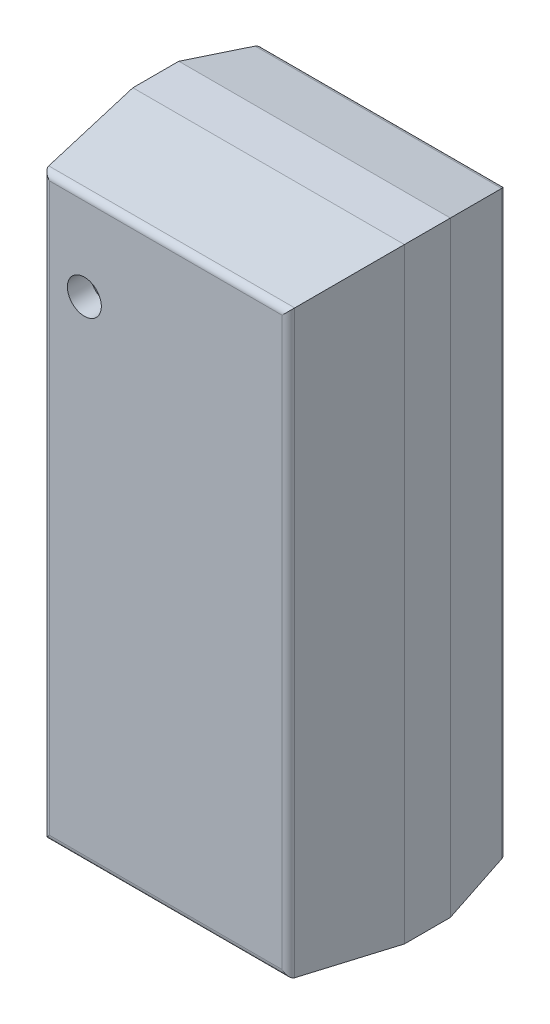
ISO-10303-21;
HEADER;
FILE_DESCRIPTION(('STEP AP214'),'2;1');
FILE_NAME('part.step','',(''),(''),'','','');
FILE_SCHEMA(('AUTOMOTIVE_DESIGN { 1 0 10303 214 1 1 1 1 }'));
ENDSEC;
DATA;
#1=APPLICATION_CONTEXT('core data for automotive mechanical design processes');
#2=APPLICATION_PROTOCOL_DEFINITION('international standard','automotive_design',2000,#1);
#3=PRODUCT_CONTEXT('',#1,'mechanical');
#4=PRODUCT('Part','Part','',(#3));
#5=PRODUCT_RELATED_PRODUCT_CATEGORY('part','',(#4));
#6=PRODUCT_DEFINITION_FORMATION('','',#4);
#7=PRODUCT_DEFINITION_CONTEXT('part definition',#1,'design');
#8=PRODUCT_DEFINITION('design','',#6,#7);
#9=PRODUCT_DEFINITION_SHAPE('','',#8);
#10=(LENGTH_UNIT() NAMED_UNIT(*) SI_UNIT(.MILLI.,.METRE.));
#11=(NAMED_UNIT(*) PLANE_ANGLE_UNIT() SI_UNIT($,.RADIAN.));
#12=(NAMED_UNIT(*) SI_UNIT($,.STERADIAN.) SOLID_ANGLE_UNIT());
#13=UNCERTAINTY_MEASURE_WITH_UNIT(LENGTH_MEASURE(1.E-05),#10,'distance_accuracy_value','');
#14=(GEOMETRIC_REPRESENTATION_CONTEXT(3) GLOBAL_UNCERTAINTY_ASSIGNED_CONTEXT((#13)) GLOBAL_UNIT_ASSIGNED_CONTEXT((#10,
#11,#12)) REPRESENTATION_CONTEXT('',''));
#15=CARTESIAN_POINT('',(0.,0.,0.));
#16=DIRECTION('',(0.,0.,1.));
#17=DIRECTION('',(1.,0.,0.));
#18=AXIS2_PLACEMENT_3D('',#15,#16,#17);
#19=CARTESIAN_POINT('',(-0.39,0.96,0.99));
#20=DIRECTION('',(0.,0.,1.));
#21=DIRECTION('',(1.,0.,0.));
#22=AXIS2_PLACEMENT_3D('',#19,#20,#21);
#23=PLANE('',#22);
#24=CARTESIAN_POINT('',(-0.39,0.96,0.99));
#25=DIRECTION('',(0.,0.,1.));
#26=DIRECTION('',(1.,0.,0.));
#27=AXIS2_PLACEMENT_3D('',#24,#25,#26);
#28=CIRCLE('',#27,0.08125);
#29=CARTESIAN_POINT('',(-0.30875,0.96,0.99));
#30=VERTEX_POINT('',#29);
#31=EDGE_CURVE('E20',#30,#30,#28,.T.);
#32=ORIENTED_EDGE('',*,*,#31,.T.);
#33=EDGE_LOOP('',(#32));
#34=FACE_BOUND('',#33,.T.);
#35=ADVANCED_FACE('F17',(#34),#23,.T.);
#36=CARTESIAN_POINT('',(-0.39,0.96,0.99));
#37=DIRECTION('',(0.,0.,1.));
#38=DIRECTION('',(1.,0.,0.));
#39=AXIS2_PLACEMENT_3D('',#36,#37,#38);
#40=CYLINDRICAL_SURFACE('',#39,0.08125);
#41=CARTESIAN_POINT('',(-0.39,0.96,1.1));
#42=DIRECTION('',(0.,0.,1.));
#43=DIRECTION('',(1.,0.,0.));
#44=AXIS2_PLACEMENT_3D('',#41,#42,#43);
#45=CIRCLE('',#44,0.08125);
#46=CARTESIAN_POINT('',(-0.30875,0.96,1.1));
#47=VERTEX_POINT('',#46);
#48=EDGE_CURVE('E100',#47,#47,#45,.F.);
#49=ORIENTED_EDGE('',*,*,#48,.F.);
#50=EDGE_LOOP('',(#49));
#51=FACE_BOUND('',#50,.T.);
#52=ORIENTED_EDGE('',*,*,#31,.F.);
#53=EDGE_LOOP('',(#52));
#54=FACE_BOUND('',#53,.T.);
#55=ADVANCED_FACE('F496',(#51,#54),#40,.F.);
#56=CARTESIAN_POINT('',(-0.65,-1.45,1.1));
#57=DIRECTION('',(0.,0.,1.));
#58=DIRECTION('',(1.,0.,0.));
#59=AXIS2_PLACEMENT_3D('',#56,#57,#58);
#60=PLANE('',#59);
#61=ORIENTED_EDGE('',*,*,#48,.T.);
#62=EDGE_LOOP('',(#61));
#63=FACE_BOUND('',#62,.T.);
#64=DIRECTION('',(0.,1.,0.));
#65=VECTOR('',#64,1.);
#66=CARTESIAN_POINT('',(0.556510431932,-1.385,1.1));
#67=LINE('',#66,#65);
#68=CARTESIAN_POINT('',(0.556510431932,1.356510431932,1.1));
#69=VERTEX_POINT('',#68);
#70=CARTESIAN_POINT('',(0.556510431932,-1.356510431932,1.1));
#71=VERTEX_POINT('',#70);
#72=EDGE_CURVE('E107',#69,#71,#67,.F.);
#73=ORIENTED_EDGE('',*,*,#72,.F.);
#74=DIRECTION('',(1.,0.,0.));
#75=VECTOR('',#74,1.);
#76=CARTESIAN_POINT('',(-0.65,1.356510431932,1.1));
#77=LINE('',#76,#75);
#78=CARTESIAN_POINT('',(-0.556510431932,1.356510431932,1.1));
#79=VERTEX_POINT('',#78);
#80=EDGE_CURVE('E96',#69,#79,#77,.F.);
#81=ORIENTED_EDGE('',*,*,#80,.T.);
#82=DIRECTION('',(0.,1.,0.));
#83=VECTOR('',#82,1.);
#84=CARTESIAN_POINT('',(-0.556510431932,-1.385,1.1));
#85=LINE('',#84,#83);
#86=CARTESIAN_POINT('',(-0.556510431932,-1.356510431932,1.1));
#87=VERTEX_POINT('',#86);
#88=EDGE_CURVE('E92',#87,#79,#85,.T.);
#89=ORIENTED_EDGE('',*,*,#88,.F.);
#90=DIRECTION('',(1.,0.,0.));
#91=VECTOR('',#90,1.);
#92=CARTESIAN_POINT('',(-0.585,-1.356510431932,1.1));
#93=LINE('',#92,#91);
#94=EDGE_CURVE('E81',#71,#87,#93,.F.);
#95=ORIENTED_EDGE('',*,*,#94,.F.);
#96=EDGE_LOOP('',(#73,#81,#89,#95));
#97=FACE_BOUND('',#96,.T.);
#98=ADVANCED_FACE('F95',(#63,#97),#60,.T.);
#99=CARTESIAN_POINT('',(-0.556510431932,-1.385,1.0675));
#100=DIRECTION('',(0.,1.,0.));
#101=DIRECTION('',(0.,0.,1.));
#102=AXIS2_PLACEMENT_3D('',#99,#100,#101);
#103=CYLINDRICAL_SURFACE('',#102,0.0325);
#104=CARTESIAN_POINT('',(-0.556510431932,1.356510431932,1.0675));
#105=DIRECTION('',(0.707106781186547,0.707106781186547,0.));
#106=DIRECTION('',(0.707106781186547,-0.707106781186547,0.));
#107=AXIS2_PLACEMENT_3D('',#104,#105,#106);
#108=ELLIPSE('',#107,0.0459619407771256,0.0325);
#109=CARTESIAN_POINT('',(-0.588730591307081,1.38873059130711,1.07175574080985));
#110=VERTEX_POINT('',#109);
#111=EDGE_CURVE('E129',#110,#79,#108,.T.);
#112=ORIENTED_EDGE('',*,*,#111,.F.);
#113=DIRECTION('',(0.,1.,0.));
#114=VECTOR('',#113,1.);
#115=CARTESIAN_POINT('',(-0.588730591307068,-1.45,1.07175574081001));
#116=LINE('',#115,#114);
#117=CARTESIAN_POINT('',(-0.588730591307081,-1.38873059130711,1.07175574080985));
#118=VERTEX_POINT('',#117);
#119=EDGE_CURVE('E104',#110,#118,#116,.F.);
#120=ORIENTED_EDGE('',*,*,#119,.T.);
#121=CARTESIAN_POINT('',(-0.556510431932,-1.356510431932,1.0675));
#122=DIRECTION('',(0.707106781186547,-0.707106781186547,0.));
#123=DIRECTION('',(0.707106781186547,0.707106781186547,0.));
#124=AXIS2_PLACEMENT_3D('',#121,#122,#123);
#125=ELLIPSE('',#124,0.0459619407771256,0.0325);
#126=EDGE_CURVE('E86',#87,#118,#125,.T.);
#127=ORIENTED_EDGE('',*,*,#126,.F.);
#128=ORIENTED_EDGE('',*,*,#88,.T.);
#129=EDGE_LOOP('',(#112,#120,#127,#128));
#130=FACE_BOUND('',#129,.T.);
#131=ADVANCED_FACE('F103',(#130),#103,.T.);
#132=CARTESIAN_POINT('',(-0.585,-1.356510431932,1.0675));
#133=DIRECTION('',(1.,0.,0.));
#134=DIRECTION('',(0.,0.,-1.));
#135=AXIS2_PLACEMENT_3D('',#132,#133,#134);
#136=CYLINDRICAL_SURFACE('',#135,0.0325);
#137=ORIENTED_EDGE('',*,*,#94,.T.);
#138=ORIENTED_EDGE('',*,*,#126,.T.);
#139=DIRECTION('',(1.,0.,0.));
#140=VECTOR('',#139,1.);
#141=CARTESIAN_POINT('',(-0.65,-1.38873059130707,1.07175574081001));
#142=LINE('',#141,#140);
#143=CARTESIAN_POINT('',(0.588730591307115,-1.38873059130708,1.07175574080985));
#144=VERTEX_POINT('',#143);
#145=EDGE_CURVE('E141',#118,#144,#142,.T.);
#146=ORIENTED_EDGE('',*,*,#145,.T.);
#147=CARTESIAN_POINT('',(0.556510431932,-1.356510431932,1.0675));
#148=DIRECTION('',(0.707106781186547,0.707106781186547,0.));
#149=DIRECTION('',(-0.707106781186547,0.707106781186547,0.));
#150=AXIS2_PLACEMENT_3D('',#147,#148,#149);
#151=ELLIPSE('',#150,0.0459619407771256,0.0325);
#152=EDGE_CURVE('E88',#71,#144,#151,.T.);
#153=ORIENTED_EDGE('',*,*,#152,.F.);
#154=EDGE_LOOP('',(#137,#138,#146,#153));
#155=FACE_BOUND('',#154,.T.);
#156=ADVANCED_FACE('F83',(#155),#136,.T.);
#157=CARTESIAN_POINT('',(0.556510431932,-1.385,1.0675));
#158=DIRECTION('',(0.,1.,0.));
#159=DIRECTION('',(0.,0.,1.));
#160=AXIS2_PLACEMENT_3D('',#157,#158,#159);
#161=CYLINDRICAL_SURFACE('',#160,0.0325);
#162=CARTESIAN_POINT('',(0.556510431932,1.356510431932,1.0675));
#163=DIRECTION('',(0.707106781186547,-0.707106781186547,0.));
#164=DIRECTION('',(0.707106781186547,0.707106781186547,0.));
#165=AXIS2_PLACEMENT_3D('',#162,#163,#164);
#166=ELLIPSE('',#165,0.0459619407771256,0.0325);
#167=CARTESIAN_POINT('',(0.588730591307081,1.38873059130711,1.07175574080985));
#168=VERTEX_POINT('',#167);
#169=EDGE_CURVE('E130',#69,#168,#166,.F.);
#170=ORIENTED_EDGE('',*,*,#169,.F.);
#171=ORIENTED_EDGE('',*,*,#72,.T.);
#172=ORIENTED_EDGE('',*,*,#152,.T.);
#173=DIRECTION('',(0.,1.,0.));
#174=VECTOR('',#173,1.);
#175=CARTESIAN_POINT('',(0.588730591307068,-1.45,1.07175574081001));
#176=LINE('',#175,#174);
#177=EDGE_CURVE('E139',#168,#144,#176,.F.);
#178=ORIENTED_EDGE('',*,*,#177,.F.);
#179=EDGE_LOOP('',(#170,#171,#172,#178));
#180=FACE_BOUND('',#179,.T.);
#181=ADVANCED_FACE('F463',(#180),#161,.T.);
#182=CARTESIAN_POINT('',(-0.585,1.356510431932,1.0675));
#183=DIRECTION('',(1.,0.,0.));
#184=DIRECTION('',(0.,0.,-1.));
#185=AXIS2_PLACEMENT_3D('',#182,#183,#184);
#186=CYLINDRICAL_SURFACE('',#185,0.0325);
#187=DIRECTION('',(1.,0.,0.));
#188=VECTOR('',#187,1.);
#189=CARTESIAN_POINT('',(-0.65,1.38873059130707,1.07175574081001));
#190=LINE('',#189,#188);
#191=EDGE_CURVE('E149',#110,#168,#190,.T.);
#192=ORIENTED_EDGE('',*,*,#191,.F.);
#193=ORIENTED_EDGE('',*,*,#111,.T.);
#194=ORIENTED_EDGE('',*,*,#80,.F.);
#195=ORIENTED_EDGE('',*,*,#169,.T.);
#196=EDGE_LOOP('',(#192,#193,#194,#195));
#197=FACE_BOUND('',#196,.T.);
#198=ADVANCED_FACE('F453',(#197),#186,.T.);
#199=CARTESIAN_POINT('',(-0.6175,-1.45,0.853942914637));
#200=DIRECTION('',(0.991389519235761,0.,-0.130945871066968));
#201=DIRECTION('',(-0.130945871066968,0.,-0.991389519235761));
#202=AXIS2_PLACEMENT_3D('',#199,#200,#201);
#203=PLANE('',#202);
#204=DIRECTION('',(0.129837452546851,-0.129837452546486,0.982997696758433));
#205=VECTOR('',#204,1.);
#206=CARTESIAN_POINT('',(-0.65,1.4499999999999,0.607885829273986));
#207=LINE('',#206,#205);
#208=CARTESIAN_POINT('',(-0.65,1.44999999999997,0.607885829273997));
#209=VERTEX_POINT('',#208);
#210=EDGE_CURVE('E155',#209,#110,#207,.T.);
#211=ORIENTED_EDGE('',*,*,#210,.F.);
#212=DIRECTION('',(0.,1.,0.));
#213=VECTOR('',#212,1.);
#214=CARTESIAN_POINT('',(-0.65,-1.45,0.607885829274));
#215=LINE('',#214,#213);
#216=CARTESIAN_POINT('',(-0.65,-1.44999999999997,0.607885829273997));
#217=VERTEX_POINT('',#216);
#218=EDGE_CURVE('E183',#209,#217,#215,.F.);
#219=ORIENTED_EDGE('',*,*,#218,.T.);
#220=DIRECTION('',(0.129837452546851,0.129837452546486,0.982997696758433));
#221=VECTOR('',#220,1.);
#222=CARTESIAN_POINT('',(-0.65,-1.4499999999999,0.607885829273986));
#223=LINE('',#222,#221);
#224=EDGE_CURVE('E142',#217,#118,#223,.T.);
#225=ORIENTED_EDGE('',*,*,#224,.T.);
#226=ORIENTED_EDGE('',*,*,#119,.F.);
#227=EDGE_LOOP('',(#211,#219,#225,#226));
#228=FACE_BOUND('',#227,.T.);
#229=ADVANCED_FACE('F444',(#228),#203,.F.);
#230=CARTESIAN_POINT('',(-0.65,-1.4175,0.853942914637));
#231=DIRECTION('',(0.,0.991389519235761,-0.130945871066968));
#232=DIRECTION('',(0.,0.130945871066968,0.991389519235761));
#233=AXIS2_PLACEMENT_3D('',#230,#231,#232);
#234=PLANE('',#233);
#235=DIRECTION('',(1.,0.,0.));
#236=VECTOR('',#235,1.);
#237=CARTESIAN_POINT('',(-0.65,-1.45,0.607885829274));
#238=LINE('',#237,#236);
#239=CARTESIAN_POINT('',(0.649999999999974,-1.45,0.607885829273997));
#240=VERTEX_POINT('',#239);
#241=EDGE_CURVE('E170',#217,#240,#238,.T.);
#242=ORIENTED_EDGE('',*,*,#241,.T.);
#243=DIRECTION('',(0.129837452546486,-0.12983745254685,-0.982997696758433));
#244=VECTOR('',#243,1.);
#245=CARTESIAN_POINT('',(0.588730591307068,-1.388730591307,1.07175574081001));
#246=LINE('',#245,#244);
#247=EDGE_CURVE('E144',#144,#240,#246,.T.);
#248=ORIENTED_EDGE('',*,*,#247,.F.);
#249=ORIENTED_EDGE('',*,*,#145,.F.);
#250=ORIENTED_EDGE('',*,*,#224,.F.);
#251=EDGE_LOOP('',(#242,#248,#249,#250));
#252=FACE_BOUND('',#251,.T.);
#253=ADVANCED_FACE('F435',(#252),#234,.F.);
#254=CARTESIAN_POINT('',(0.6175,-1.45,0.853942914637));
#255=DIRECTION('',(0.991389519235761,0.,0.130945871066968));
#256=DIRECTION('',(0.130945871066968,0.,-0.991389519235761));
#257=AXIS2_PLACEMENT_3D('',#254,#255,#256);
#258=PLANE('',#257);
#259=DIRECTION('',(0.129837452546851,0.129837452546486,-0.982997696758433));
#260=VECTOR('',#259,1.);
#261=CARTESIAN_POINT('',(0.588730591307,1.38873059130707,1.07175574081001));
#262=LINE('',#261,#260);
#263=CARTESIAN_POINT('',(0.65,1.44999999999997,0.607885829273997));
#264=VERTEX_POINT('',#263);
#265=EDGE_CURVE('E150',#168,#264,#262,.T.);
#266=ORIENTED_EDGE('',*,*,#265,.F.);
#267=ORIENTED_EDGE('',*,*,#177,.T.);
#268=ORIENTED_EDGE('',*,*,#247,.T.);
#269=DIRECTION('',(0.,1.,0.));
#270=VECTOR('',#269,1.);
#271=CARTESIAN_POINT('',(0.65,-1.45,0.607885829274));
#272=LINE('',#271,#270);
#273=EDGE_CURVE('E180',#264,#240,#272,.F.);
#274=ORIENTED_EDGE('',*,*,#273,.F.);
#275=EDGE_LOOP('',(#266,#267,#268,#274));
#276=FACE_BOUND('',#275,.T.);
#277=ADVANCED_FACE('F426',(#276),#258,.T.);
#278=CARTESIAN_POINT('',(-0.65,1.4175,0.853942914637));
#279=DIRECTION('',(0.,0.991389519235761,0.130945871066968));
#280=DIRECTION('',(0.,-0.130945871066968,0.991389519235761));
#281=AXIS2_PLACEMENT_3D('',#278,#279,#280);
#282=PLANE('',#281);
#283=DIRECTION('',(1.,0.,0.));
#284=VECTOR('',#283,1.);
#285=CARTESIAN_POINT('',(-0.65,1.45,0.607885829274));
#286=LINE('',#285,#284);
#287=EDGE_CURVE('E202',#209,#264,#286,.T.);
#288=ORIENTED_EDGE('',*,*,#287,.F.);
#289=ORIENTED_EDGE('',*,*,#210,.T.);
#290=ORIENTED_EDGE('',*,*,#191,.T.);
#291=ORIENTED_EDGE('',*,*,#265,.T.);
#292=EDGE_LOOP('',(#288,#289,#290,#291));
#293=FACE_BOUND('',#292,.T.);
#294=ADVANCED_FACE('F417',(#293),#282,.T.);
#295=CARTESIAN_POINT('',(-0.65,-1.45,0.0565));
#296=DIRECTION('',(1.,0.,0.));
#297=DIRECTION('',(0.,0.,-1.));
#298=AXIS2_PLACEMENT_3D('',#295,#296,#297);
#299=PLANE('',#298);
#300=DIRECTION('',(0.,0.,1.));
#301=VECTOR('',#300,1.);
#302=CARTESIAN_POINT('',(-0.65,1.45,0.0565));
#303=LINE('',#302,#301);
#304=CARTESIAN_POINT('',(-0.649999999999982,1.44999999999995,0.38788582927401));
#305=VERTEX_POINT('',#304);
#306=EDGE_CURVE('E206',#305,#209,#303,.T.);
#307=ORIENTED_EDGE('',*,*,#306,.F.);
#308=DIRECTION('',(0.,1.,0.));
#309=VECTOR('',#308,1.);
#310=CARTESIAN_POINT('',(-0.64999999999993,-1.45,0.387885829274014));
#311=LINE('',#310,#309);
#312=CARTESIAN_POINT('',(-0.649999999999982,-1.44999999999996,0.38788582927401));
#313=VERTEX_POINT('',#312);
#314=EDGE_CURVE('E205',#313,#305,#311,.T.);
#315=ORIENTED_EDGE('',*,*,#314,.F.);
#316=DIRECTION('',(0.,0.,1.));
#317=VECTOR('',#316,1.);
#318=CARTESIAN_POINT('',(-0.65,-1.45,0.0565));
#319=LINE('',#318,#317);
#320=EDGE_CURVE('E173',#313,#217,#319,.T.);
#321=ORIENTED_EDGE('',*,*,#320,.T.);
#322=ORIENTED_EDGE('',*,*,#218,.F.);
#323=EDGE_LOOP('',(#307,#315,#321,#322));
#324=FACE_BOUND('',#323,.T.);
#325=ADVANCED_FACE('F407',(#324),#299,.F.);
#326=CARTESIAN_POINT('',(-0.65,-1.45,0.0565));
#327=DIRECTION('',(0.,1.,0.));
#328=DIRECTION('',(0.,0.,1.));
#329=AXIS2_PLACEMENT_3D('',#326,#327,#328);
#330=PLANE('',#329);
#331=ORIENTED_EDGE('',*,*,#320,.F.);
#332=DIRECTION('',(1.,0.,0.));
#333=VECTOR('',#332,1.);
#334=CARTESIAN_POINT('',(-0.65,-1.44999999999993,0.387885829274014));
#335=LINE('',#334,#333);
#336=CARTESIAN_POINT('',(0.649999999999965,-1.44999999999998,0.387885829274014));
#337=VERTEX_POINT('',#336);
#338=EDGE_CURVE('E235',#337,#313,#335,.F.);
#339=ORIENTED_EDGE('',*,*,#338,.F.);
#340=DIRECTION('',(0.,0.,-1.));
#341=VECTOR('',#340,1.);
#342=CARTESIAN_POINT('',(0.65,-1.45,0.0565));
#343=LINE('',#342,#341);
#344=EDGE_CURVE('E172',#240,#337,#343,.T.);
#345=ORIENTED_EDGE('',*,*,#344,.F.);
#346=ORIENTED_EDGE('',*,*,#241,.F.);
#347=EDGE_LOOP('',(#331,#339,#345,#346));
#348=FACE_BOUND('',#347,.T.);
#349=ADVANCED_FACE('F398',(#348),#330,.F.);
#350=CARTESIAN_POINT('',(0.65,-1.45,0.0565));
#351=DIRECTION('',(1.,0.,0.));
#352=DIRECTION('',(0.,0.,-1.));
#353=AXIS2_PLACEMENT_3D('',#350,#351,#352);
#354=PLANE('',#353);
#355=DIRECTION('',(0.,0.,1.));
#356=VECTOR('',#355,1.);
#357=CARTESIAN_POINT('',(0.65,1.45,0.0565));
#358=LINE('',#357,#356);
#359=CARTESIAN_POINT('',(0.649999999999983,1.44999999999997,0.387885829274014));
#360=VERTEX_POINT('',#359);
#361=EDGE_CURVE('E210',#264,#360,#358,.F.);
#362=ORIENTED_EDGE('',*,*,#361,.F.);
#363=ORIENTED_EDGE('',*,*,#273,.T.);
#364=ORIENTED_EDGE('',*,*,#344,.T.);
#365=DIRECTION('',(0.,1.,0.));
#366=VECTOR('',#365,1.);
#367=CARTESIAN_POINT('',(0.64999999999993,-1.45,0.387885829274014));
#368=LINE('',#367,#366);
#369=EDGE_CURVE('E228',#337,#360,#368,.T.);
#370=ORIENTED_EDGE('',*,*,#369,.T.);
#371=EDGE_LOOP('',(#362,#363,#364,#370));
#372=FACE_BOUND('',#371,.T.);
#373=ADVANCED_FACE('F389',(#372),#354,.T.);
#374=CARTESIAN_POINT('',(-0.65,1.45,0.0565));
#375=DIRECTION('',(0.,1.,0.));
#376=DIRECTION('',(0.,0.,1.));
#377=AXIS2_PLACEMENT_3D('',#374,#375,#376);
#378=PLANE('',#377);
#379=ORIENTED_EDGE('',*,*,#306,.T.);
#380=ORIENTED_EDGE('',*,*,#287,.T.);
#381=ORIENTED_EDGE('',*,*,#361,.T.);
#382=DIRECTION('',(1.,0.,0.));
#383=VECTOR('',#382,1.);
#384=CARTESIAN_POINT('',(-0.65,1.44999999999993,0.387885829274014));
#385=LINE('',#384,#383);
#386=EDGE_CURVE('E254',#360,#305,#385,.F.);
#387=ORIENTED_EDGE('',*,*,#386,.T.);
#388=EDGE_LOOP('',(#379,#380,#381,#387));
#389=FACE_BOUND('',#388,.T.);
#390=ADVANCED_FACE('F380',(#389),#378,.T.);
#391=CARTESIAN_POINT('',(-0.6175,-1.45,0.222192914637));
#392=DIRECTION('',(-0.981301230648835,0.,-0.192478296768968));
#393=DIRECTION('',(-0.192478296768968,0.,0.981301230648835));
#394=AXIS2_PLACEMENT_3D('',#391,#392,#393);
#395=PLANE('',#394);
#396=DIRECTION('',(0.189008945817672,-0.189008945815824,-0.963613634608023));
#397=VECTOR('',#396,1.);
#398=CARTESIAN_POINT('',(-0.65,1.44999999999993,0.387885829274014));
#399=LINE('',#398,#397);
#400=CARTESIAN_POINT('',(-0.590147744554066,1.39014774455431,0.0827444553549845));
#401=VERTEX_POINT('',#400);
#402=EDGE_CURVE('E256',#305,#401,#399,.T.);
#403=ORIENTED_EDGE('',*,*,#402,.T.);
#404=DIRECTION('',(0.,1.,0.));
#405=VECTOR('',#404,1.);
#406=CARTESIAN_POINT('',(-0.590147744554082,-1.385,0.0827444553549839));
#407=LINE('',#406,#405);
#408=CARTESIAN_POINT('',(-0.590147744554066,-1.39014774455431,0.0827444553549846));
#409=VERTEX_POINT('',#408);
#410=EDGE_CURVE('E128',#409,#401,#407,.T.);
#411=ORIENTED_EDGE('',*,*,#410,.F.);
#412=DIRECTION('',(0.189008945817672,0.189008945815824,-0.963613634608023));
#413=VECTOR('',#412,1.);
#414=CARTESIAN_POINT('',(-0.65,-1.44999999999993,0.387885829274014));
#415=LINE('',#414,#413);
#416=EDGE_CURVE('E237',#313,#409,#415,.T.);
#417=ORIENTED_EDGE('',*,*,#416,.F.);
#418=ORIENTED_EDGE('',*,*,#314,.T.);
#419=EDGE_LOOP('',(#403,#411,#417,#418));
#420=FACE_BOUND('',#419,.T.);
#421=ADVANCED_FACE('F301',(#420),#395,.T.);
#422=CARTESIAN_POINT('',(-0.65,-1.4175,0.222192914637));
#423=DIRECTION('',(0.,-0.981301230648835,-0.192478296768968));
#424=DIRECTION('',(0.,0.192478296768968,-0.981301230648835));
#425=AXIS2_PLACEMENT_3D('',#422,#423,#424);
#426=PLANE('',#425);
#427=ORIENTED_EDGE('',*,*,#338,.T.);
#428=ORIENTED_EDGE('',*,*,#416,.T.);
#429=DIRECTION('',(1.,0.,0.));
#430=VECTOR('',#429,1.);
#431=CARTESIAN_POINT('',(-0.585,-1.39014774455408,0.0827444553549839));
#432=LINE('',#431,#430);
#433=CARTESIAN_POINT('',(0.590147744554308,-1.39014774455407,0.0827444553549846));
#434=VERTEX_POINT('',#433);
#435=EDGE_CURVE('E127',#434,#409,#432,.F.);
#436=ORIENTED_EDGE('',*,*,#435,.F.);
#437=DIRECTION('',(0.189008945815824,-0.189008945817671,0.963613634608023));
#438=VECTOR('',#437,1.);
#439=CARTESIAN_POINT('',(0.590147744554515,-1.390147744554,0.0827444553548989));
#440=LINE('',#439,#438);
#441=EDGE_CURVE('E231',#434,#337,#440,.T.);
#442=ORIENTED_EDGE('',*,*,#441,.T.);
#443=EDGE_LOOP('',(#427,#428,#436,#442));
#444=FACE_BOUND('',#443,.T.);
#445=ADVANCED_FACE('F275',(#444),#426,.T.);
#446=CARTESIAN_POINT('',(0.6175,-1.45,0.222192914637));
#447=DIRECTION('',(-0.981301230648835,0.,0.192478296768968));
#448=DIRECTION('',(0.192478296768968,0.,0.981301230648835));
#449=AXIS2_PLACEMENT_3D('',#446,#447,#448);
#450=PLANE('',#449);
#451=DIRECTION('',(0.189008945817672,0.189008945815824,0.963613634608023));
#452=VECTOR('',#451,1.);
#453=CARTESIAN_POINT('',(0.590147744554,1.39014774455451,0.0827444553548989));
#454=LINE('',#453,#452);
#455=CARTESIAN_POINT('',(0.590147744554066,1.39014774455431,0.0827444553549846));
#456=VERTEX_POINT('',#455);
#457=EDGE_CURVE('E230',#456,#360,#454,.T.);
#458=ORIENTED_EDGE('',*,*,#457,.T.);
#459=ORIENTED_EDGE('',*,*,#369,.F.);
#460=ORIENTED_EDGE('',*,*,#441,.F.);
#461=DIRECTION('',(0.,1.,0.));
#462=VECTOR('',#461,1.);
#463=CARTESIAN_POINT('',(0.590147744554082,-1.385,0.0827444553549839));
#464=LINE('',#463,#462);
#465=EDGE_CURVE('E124',#456,#434,#464,.F.);
#466=ORIENTED_EDGE('',*,*,#465,.F.);
#467=EDGE_LOOP('',(#458,#459,#460,#466));
#468=FACE_BOUND('',#467,.T.);
#469=ADVANCED_FACE('F280',(#468),#450,.F.);
#470=CARTESIAN_POINT('',(-0.65,1.4175,0.222192914637));
#471=DIRECTION('',(0.,-0.981301230648835,0.192478296768968));
#472=DIRECTION('',(0.,-0.192478296768968,-0.981301230648835));
#473=AXIS2_PLACEMENT_3D('',#470,#471,#472);
#474=PLANE('',#473);
#475=ORIENTED_EDGE('',*,*,#386,.F.);
#476=ORIENTED_EDGE('',*,*,#457,.F.);
#477=DIRECTION('',(1.,0.,0.));
#478=VECTOR('',#477,1.);
#479=CARTESIAN_POINT('',(-0.585,1.39014774455408,0.0827444553549839));
#480=LINE('',#479,#478);
#481=EDGE_CURVE('E118',#401,#456,#480,.T.);
#482=ORIENTED_EDGE('',*,*,#481,.F.);
#483=ORIENTED_EDGE('',*,*,#402,.F.);
#484=EDGE_LOOP('',(#475,#476,#482,#483));
#485=FACE_BOUND('',#484,.T.);
#486=ADVANCED_FACE('F303',(#485),#474,.F.);
#487=CARTESIAN_POINT('',(-0.558255454558,-1.385,0.089));
#488=DIRECTION('',(0.,1.,0.));
#489=DIRECTION('',(0.,0.,1.));
#490=AXIS2_PLACEMENT_3D('',#487,#488,#489);
#491=CYLINDRICAL_SURFACE('',#490,0.0325);
#492=DIRECTION('',(0.,1.,0.));
#493=VECTOR('',#492,1.);
#494=CARTESIAN_POINT('',(-0.558255454558,-1.45,0.0565));
#495=LINE('',#494,#493);
#496=CARTESIAN_POINT('',(-0.558255454558,1.358255454558,0.0565));
#497=VERTEX_POINT('',#496);
#498=CARTESIAN_POINT('',(-0.558255454558,-1.358255454558,0.0565));
#499=VERTEX_POINT('',#498);
#500=EDGE_CURVE('E117',#497,#499,#495,.F.);
#501=ORIENTED_EDGE('',*,*,#500,.T.);
#502=CARTESIAN_POINT('',(-0.558255454558,-1.358255454558,0.089));
#503=DIRECTION('',(0.707106781186547,-0.707106781186547,0.));
#504=DIRECTION('',(0.707106781186547,0.707106781186547,0.));
#505=AXIS2_PLACEMENT_3D('',#502,#503,#504);
#506=ELLIPSE('',#505,0.0459619407771256,0.0325);
#507=EDGE_CURVE('E125',#409,#499,#506,.T.);
#508=ORIENTED_EDGE('',*,*,#507,.F.);
#509=ORIENTED_EDGE('',*,*,#410,.T.);
#510=CARTESIAN_POINT('',(-0.558255454558,1.358255454558,0.089));
#511=DIRECTION('',(0.707106781186547,0.707106781186547,0.));
#512=DIRECTION('',(0.707106781186547,-0.707106781186547,0.));
#513=AXIS2_PLACEMENT_3D('',#510,#511,#512);
#514=ELLIPSE('',#513,0.0459619407771256,0.0325);
#515=EDGE_CURVE('E119',#497,#401,#514,.T.);
#516=ORIENTED_EDGE('',*,*,#515,.F.);
#517=EDGE_LOOP('',(#501,#508,#509,#516));
#518=FACE_BOUND('',#517,.T.);
#519=ADVANCED_FACE('F297',(#518),#491,.T.);
#520=CARTESIAN_POINT('',(-0.585,-1.358255454558,0.089));
#521=DIRECTION('',(1.,0.,0.));
#522=DIRECTION('',(0.,0.,-1.));
#523=AXIS2_PLACEMENT_3D('',#520,#521,#522);
#524=CYLINDRICAL_SURFACE('',#523,0.0325);
#525=CARTESIAN_POINT('',(0.558255454558,-1.358255454558,0.089));
#526=DIRECTION('',(0.707106781186547,0.707106781186547,0.));
#527=DIRECTION('',(-0.707106781186547,0.707106781186547,0.));
#528=AXIS2_PLACEMENT_3D('',#525,#526,#527);
#529=ELLIPSE('',#528,0.0459619407771256,0.0325);
#530=CARTESIAN_POINT('',(0.558255454558,-1.358255454558,0.0565));
#531=VERTEX_POINT('',#530);
#532=EDGE_CURVE('E122',#434,#531,#529,.T.);
#533=ORIENTED_EDGE('',*,*,#532,.F.);
#534=ORIENTED_EDGE('',*,*,#435,.T.);
#535=ORIENTED_EDGE('',*,*,#507,.T.);
#536=DIRECTION('',(1.,0.,0.));
#537=VECTOR('',#536,1.);
#538=CARTESIAN_POINT('',(-0.65,-1.358255454558,0.0565));
#539=LINE('',#538,#537);
#540=EDGE_CURVE('E289',#499,#531,#539,.T.);
#541=ORIENTED_EDGE('',*,*,#540,.T.);
#542=EDGE_LOOP('',(#533,#534,#535,#541));
#543=FACE_BOUND('',#542,.T.);
#544=ADVANCED_FACE('F310',(#543),#524,.T.);
#545=CARTESIAN_POINT('',(0.558255454558,-1.385,0.089));
#546=DIRECTION('',(0.,1.,0.));
#547=DIRECTION('',(0.,0.,1.));
#548=AXIS2_PLACEMENT_3D('',#545,#546,#547);
#549=CYLINDRICAL_SURFACE('',#548,0.0325);
#550=ORIENTED_EDGE('',*,*,#465,.T.);
#551=ORIENTED_EDGE('',*,*,#532,.T.);
#552=DIRECTION('',(0.,1.,0.));
#553=VECTOR('',#552,1.);
#554=CARTESIAN_POINT('',(0.558255454558,-1.45,0.0565));
#555=LINE('',#554,#553);
#556=CARTESIAN_POINT('',(0.558255454558,1.358255454558,0.0565));
#557=VERTEX_POINT('',#556);
#558=EDGE_CURVE('E26',#531,#557,#555,.T.);
#559=ORIENTED_EDGE('',*,*,#558,.T.);
#560=CARTESIAN_POINT('',(0.558255454558,1.358255454558,0.089));
#561=DIRECTION('',(0.707106781186547,-0.707106781186547,0.));
#562=DIRECTION('',(0.707106781186547,0.707106781186547,0.));
#563=AXIS2_PLACEMENT_3D('',#560,#561,#562);
#564=ELLIPSE('',#563,0.0459619407771256,0.0325);
#565=EDGE_CURVE('E34',#456,#557,#564,.F.);
#566=ORIENTED_EDGE('',*,*,#565,.F.);
#567=EDGE_LOOP('',(#550,#551,#559,#566));
#568=FACE_BOUND('',#567,.T.);
#569=ADVANCED_FACE('F282',(#568),#549,.T.);
#570=CARTESIAN_POINT('',(-0.585,1.358255454558,0.089));
#571=DIRECTION('',(1.,0.,0.));
#572=DIRECTION('',(0.,0.,-1.));
#573=AXIS2_PLACEMENT_3D('',#570,#571,#572);
#574=CYLINDRICAL_SURFACE('',#573,0.0325);
#575=ORIENTED_EDGE('',*,*,#565,.T.);
#576=DIRECTION('',(1.,0.,0.));
#577=VECTOR('',#576,1.);
#578=CARTESIAN_POINT('',(-0.65,1.358255454558,0.0565));
#579=LINE('',#578,#577);
#580=EDGE_CURVE('E11',#557,#497,#579,.F.);
#581=ORIENTED_EDGE('',*,*,#580,.T.);
#582=ORIENTED_EDGE('',*,*,#515,.T.);
#583=ORIENTED_EDGE('',*,*,#481,.T.);
#584=EDGE_LOOP('',(#575,#581,#582,#583));
#585=FACE_BOUND('',#584,.T.);
#586=ADVANCED_FACE('F298',(#585),#574,.T.);
#587=CARTESIAN_POINT('',(-0.65,-1.45,0.0565));
#588=DIRECTION('',(0.,0.,1.));
#589=DIRECTION('',(1.,0.,0.));
#590=AXIS2_PLACEMENT_3D('',#587,#588,#589);
#591=PLANE('',#590);
#592=ORIENTED_EDGE('',*,*,#558,.F.);
#593=ORIENTED_EDGE('',*,*,#540,.F.);
#594=ORIENTED_EDGE('',*,*,#500,.F.);
#595=ORIENTED_EDGE('',*,*,#580,.F.);
#596=EDGE_LOOP('',(#592,#593,#594,#595));
#597=FACE_BOUND('',#596,.T.);
#598=ADVANCED_FACE('F308',(#597),#591,.F.);
#599=CLOSED_SHELL('',(#35,#55,#98,#131,#156,#181,#198,#229,#253,#277,#294,#325,#349,#373,#390,
#421,#445,#469,#486,#519,#544,#569,#586,#598));
#600=MANIFOLD_SOLID_BREP('B1',#599);
#601=ADVANCED_BREP_SHAPE_REPRESENTATION('',(#18,#600),#14);
#602=SHAPE_DEFINITION_REPRESENTATION(#9,#601);
ENDSEC;
END-ISO-10303-21;
